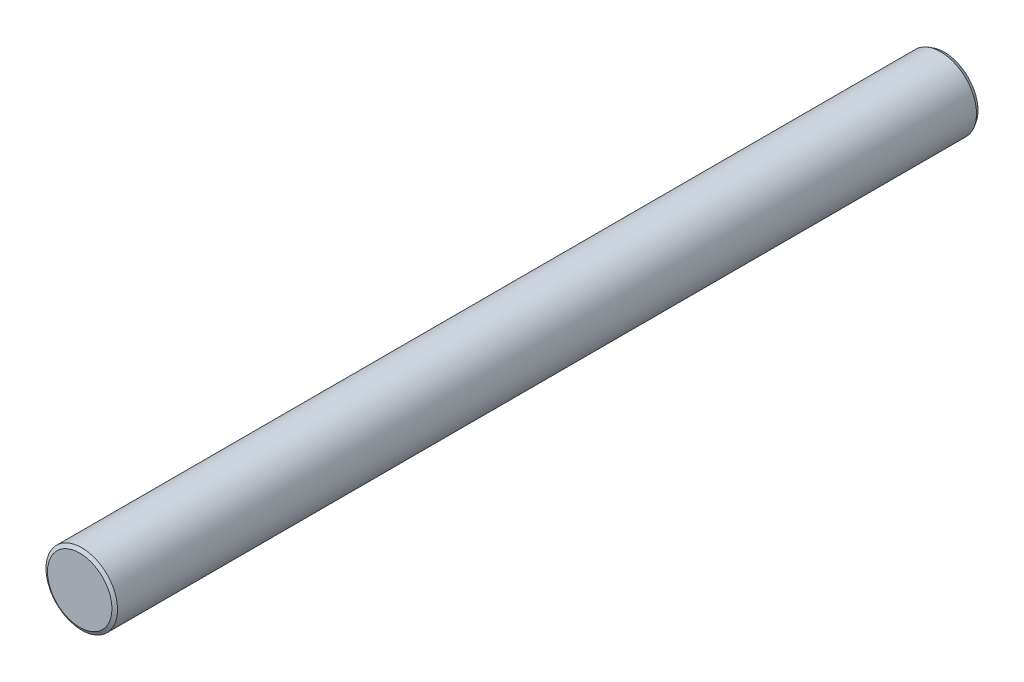
ISO-10303-21;
HEADER;
FILE_DESCRIPTION(('STEP AP214'),'2;1');
FILE_NAME('part.step','',(''),(''),'','','');
FILE_SCHEMA(('AUTOMOTIVE_DESIGN { 1 0 10303 214 1 1 1 1 }'));
ENDSEC;
DATA;
#1=APPLICATION_CONTEXT('core data for automotive mechanical design processes');
#2=APPLICATION_PROTOCOL_DEFINITION('international standard','automotive_design',2000,#1);
#3=PRODUCT_CONTEXT('',#1,'mechanical');
#4=PRODUCT('Part','Part','',(#3));
#5=PRODUCT_RELATED_PRODUCT_CATEGORY('part','',(#4));
#6=PRODUCT_DEFINITION_FORMATION('','',#4);
#7=PRODUCT_DEFINITION_CONTEXT('part definition',#1,'design');
#8=PRODUCT_DEFINITION('design','',#6,#7);
#9=PRODUCT_DEFINITION_SHAPE('','',#8);
#10=(LENGTH_UNIT() NAMED_UNIT(*) SI_UNIT(.MILLI.,.METRE.));
#11=(NAMED_UNIT(*) PLANE_ANGLE_UNIT() SI_UNIT($,.RADIAN.));
#12=(NAMED_UNIT(*) SI_UNIT($,.STERADIAN.) SOLID_ANGLE_UNIT());
#13=UNCERTAINTY_MEASURE_WITH_UNIT(LENGTH_MEASURE(1.E-05),#10,'distance_accuracy_value','');
#14=(GEOMETRIC_REPRESENTATION_CONTEXT(3) GLOBAL_UNCERTAINTY_ASSIGNED_CONTEXT((#13)) GLOBAL_UNIT_ASSIGNED_CONTEXT((#10,
#11,#12)) REPRESENTATION_CONTEXT('',''));
#15=CARTESIAN_POINT('',(0.,0.,0.));
#16=DIRECTION('',(0.,0.,1.));
#17=DIRECTION('',(1.,0.,0.));
#18=AXIS2_PLACEMENT_3D('',#15,#16,#17);
#19=CARTESIAN_POINT('',(0.,0.,42.));
#20=DIRECTION('',(0.,0.,-1.));
#21=DIRECTION('',(-1.,0.,0.));
#22=AXIS2_PLACEMENT_3D('',#19,#20,#21);
#23=CYLINDRICAL_SURFACE('',#22,3.475);
#24=CARTESIAN_POINT('',(0.,0.,-41.6535898384861));
#25=DIRECTION('',(0.,0.,1.));
#26=DIRECTION('',(1.,0.,0.));
#27=AXIS2_PLACEMENT_3D('',#24,#25,#26);
#28=CIRCLE('',#27,3.475);
#29=CARTESIAN_POINT('',(-3.475,0.,-41.6535898384861));
#30=VERTEX_POINT('',#29);
#31=EDGE_CURVE('E59',#30,#30,#28,.T.);
#32=CARTESIAN_POINT('',(0.,0.,41.8));
#33=DIRECTION('',(0.,0.,1.));
#34=DIRECTION('',(1.,0.,0.));
#35=AXIS2_PLACEMENT_3D('',#32,#33,#34);
#36=CIRCLE('',#35,3.475);
#37=CARTESIAN_POINT('',(-3.475,0.,41.8));
#38=VERTEX_POINT('',#37);
#39=EDGE_CURVE('E64',#38,#38,#36,.F.);
#40=CARTESIAN_POINT('',(-3.475,0.,-41.6535898384861));
#41=CARTESIAN_POINT('',(-3.475,0.,-40.7842816110018));
#42=CARTESIAN_POINT('',(-3.475,0.,-39.9149733835176));
#43=CARTESIAN_POINT('',(-3.475,0.,-38.1763569285491));
#44=CARTESIAN_POINT('',(-3.475,0.,-37.3070487010649));
#45=CARTESIAN_POINT('',(-3.475,0.,-35.5684322460965));
#46=CARTESIAN_POINT('',(-3.475,0.,-34.6991240186122));
#47=CARTESIAN_POINT('',(-3.475,0.,-32.9605075636438));
#48=CARTESIAN_POINT('',(-3.475,0.,-32.0911993361595));
#49=CARTESIAN_POINT('',(-3.475,0.,-30.3525828811911));
#50=CARTESIAN_POINT('',(-3.475,0.,-29.4832746537069));
#51=CARTESIAN_POINT('',(-3.475,0.,-27.7446581987384));
#52=CARTESIAN_POINT('',(-3.475,0.,-26.8753499712542));
#53=CARTESIAN_POINT('',(-3.475,0.,-25.1367335162857));
#54=CARTESIAN_POINT('',(-3.475,0.,-24.2674252888015));
#55=CARTESIAN_POINT('',(-3.475,0.,-22.528808833833));
#56=CARTESIAN_POINT('',(-3.475,0.,-21.6595006063488));
#57=CARTESIAN_POINT('',(-3.475,0.,-19.9208841513803));
#58=CARTESIAN_POINT('',(-3.475,0.,-19.0515759238961));
#59=CARTESIAN_POINT('',(-3.475,0.,-17.3129594689276));
#60=CARTESIAN_POINT('',(-3.475,0.,-16.4436512414434));
#61=CARTESIAN_POINT('',(-3.475,0.,-14.7050347864749));
#62=CARTESIAN_POINT('',(-3.475,0.,-13.8357265589907));
#63=CARTESIAN_POINT('',(-3.475,0.,-12.0971101040223));
#64=CARTESIAN_POINT('',(-3.475,0.,-11.227801876538));
#65=CARTESIAN_POINT('',(-3.475,0.,-9.48918542156956));
#66=CARTESIAN_POINT('',(-3.475,0.,-8.61987719408534));
#67=CARTESIAN_POINT('',(-3.475,0.,-6.88126073911687));
#68=CARTESIAN_POINT('',(-3.475,0.,-6.01195251163264));
#69=CARTESIAN_POINT('',(-3.475,0.,-4.27333605666418));
#70=CARTESIAN_POINT('',(-3.475,0.,-3.40402782917995));
#71=CARTESIAN_POINT('',(-3.475,0.,-1.66541137421149));
#72=CARTESIAN_POINT('',(-3.475,0.,-0.796103146727259));
#73=CARTESIAN_POINT('',(-3.475,0.,0.9425133082412));
#74=CARTESIAN_POINT('',(-3.475,0.,1.81182153572543));
#75=CARTESIAN_POINT('',(-3.475,0.,3.55043799069389));
#76=CARTESIAN_POINT('',(-3.475,0.,4.41974621817812));
#77=CARTESIAN_POINT('',(-3.475,0.,6.15836267314658));
#78=CARTESIAN_POINT('',(-3.475,0.,7.02767090063081));
#79=CARTESIAN_POINT('',(-3.475,0.,8.76628735559927));
#80=CARTESIAN_POINT('',(-3.475,0.,9.6355955830835));
#81=CARTESIAN_POINT('',(-3.475,0.,11.374212038052));
#82=CARTESIAN_POINT('',(-3.475,0.,12.2435202655362));
#83=CARTESIAN_POINT('',(-3.475,0.,13.9821367205047));
#84=CARTESIAN_POINT('',(-3.475,0.,14.8514449479889));
#85=CARTESIAN_POINT('',(-3.475,0.,16.5900614029573));
#86=CARTESIAN_POINT('',(-3.475,0.,17.4593696304416));
#87=CARTESIAN_POINT('',(-3.475,0.,19.19798608541));
#88=CARTESIAN_POINT('',(-3.475,0.,20.0672943128943));
#89=CARTESIAN_POINT('',(-3.475,0.,21.8059107678627));
#90=CARTESIAN_POINT('',(-3.475,0.,22.6752189953469));
#91=CARTESIAN_POINT('',(-3.475,0.,24.4138354503154));
#92=CARTESIAN_POINT('',(-3.475,0.,25.2831436777996));
#93=CARTESIAN_POINT('',(-3.475,0.,27.0217601327681));
#94=CARTESIAN_POINT('',(-3.475,0.,27.8910683602523));
#95=CARTESIAN_POINT('',(-3.475,0.,29.6296848152208));
#96=CARTESIAN_POINT('',(-3.475,0.,30.498993042705));
#97=CARTESIAN_POINT('',(-3.475,0.,32.2376094976735));
#98=CARTESIAN_POINT('',(-3.475,0.,33.1069177251577));
#99=CARTESIAN_POINT('',(-3.475,0.,34.8455341801262));
#100=CARTESIAN_POINT('',(-3.475,0.,35.7148424076104));
#101=CARTESIAN_POINT('',(-3.475,0.,37.4534588625789));
#102=CARTESIAN_POINT('',(-3.475,0.,38.3227670900631));
#103=CARTESIAN_POINT('',(-3.475,0.,40.0613835450316));
#104=CARTESIAN_POINT('',(-3.475,0.,40.9306917725158));
#105=CARTESIAN_POINT('',(-3.475,0.,41.8));
#106=B_SPLINE_CURVE_WITH_KNOTS('',3,(#40,#41,#42,#43,#44,#45,#46,#47,#48,#49,#50,#51,#52,#53,
#54,#55,#56,#57,#58,#59,#60,#61,#62,#63,#64,#65,#66,#67,#68,#69,#70,#71,#72,#73,#74,#75,#76,#77,
#78,#79,#80,#81,#82,#83,#84,#85,#86,#87,#88,#89,#90,#91,#92,#93,#94,#95,#96,#97,#98,#99,#100,
#101,#102,#103,#104,#105),.UNSPECIFIED.,.F.,.F.,(4,2,2,2,2,2,2,2,2,2,2,2,2,2,2,2,2,2,2,2,2,2,2,
2,2,2,2,2,2,2,2,2,4),(0.,2.60792468245269,5.21584936490538,7.82377404735807,10.4316987298108,
13.0396234122634,15.6475480947161,18.2554727771688,20.8633974596215,23.4713221420742,
26.0792468245269,28.6871715069796,31.2950961894323,33.903020871885,36.5109455543377,
39.1188702367904,41.726794919243,44.3347196016957,46.9426442841484,49.5505689666011,
52.1584936490538,54.7664183315065,57.3743430139592,59.9822676964119,62.5901923788646,
65.1981170613172,67.8060417437699,70.4139664262226,73.0218911086753,75.629815791128,
78.2377404735807,80.8456651560334,83.4535898384861),.UNSPECIFIED.);
#107=EDGE_CURVE('BSEAM45',#30,#38,#106,.T.);
#108=ORIENTED_EDGE('',*,*,#31,.T.);
#109=ORIENTED_EDGE('',*,*,#39,.T.);
#110=ORIENTED_EDGE('',*,*,#107,.T.);
#111=ORIENTED_EDGE('',*,*,#107,.F.);
#112=EDGE_LOOP('',(#108,#110,#109,#111));
#113=FACE_BOUND('',#112,.T.);
#114=ADVANCED_FACE('F45',(#113),#23,.T.);
#115=CARTESIAN_POINT('',(0.,0.,42.));
#116=DIRECTION('',(0.,0.,1.));
#117=DIRECTION('',(1.,0.,0.));
#118=AXIS2_PLACEMENT_3D('',#115,#116,#117);
#119=PLANE('',#118);
#120=CARTESIAN_POINT('',(0.,0.,42.));
#121=DIRECTION('',(0.,0.,1.));
#122=DIRECTION('',(1.,0.,0.));
#123=AXIS2_PLACEMENT_3D('',#120,#121,#122);
#124=CIRCLE('',#123,3.12858983848624);
#125=CARTESIAN_POINT('',(3.12858983848624,0.,42.));
#126=VERTEX_POINT('',#125);
#127=EDGE_CURVE('E10',#126,#126,#124,.T.);
#128=ORIENTED_EDGE('',*,*,#127,.T.);
#129=EDGE_LOOP('',(#128));
#130=FACE_BOUND('',#129,.T.);
#131=ADVANCED_FACE('F81',(#130),#119,.T.);
#132=CARTESIAN_POINT('',(0.,0.,-42.));
#133=DIRECTION('',(0.,0.,1.));
#134=DIRECTION('',(1.,0.,0.));
#135=AXIS2_PLACEMENT_3D('',#132,#133,#134);
#136=PLANE('',#135);
#137=CARTESIAN_POINT('',(0.,0.,-42.));
#138=DIRECTION('',(0.,0.,1.));
#139=DIRECTION('',(1.,0.,0.));
#140=AXIS2_PLACEMENT_3D('',#137,#138,#139);
#141=CIRCLE('',#140,3.27499999999992);
#142=CARTESIAN_POINT('',(3.27499999999992,0.,-42.));
#143=VERTEX_POINT('',#142);
#144=EDGE_CURVE('E54',#143,#143,#141,.F.);
#145=ORIENTED_EDGE('',*,*,#144,.T.);
#146=EDGE_LOOP('',(#145));
#147=FACE_BOUND('',#146,.T.);
#148=ADVANCED_FACE('F78',(#147),#136,.F.);
#149=CARTESIAN_POINT('',(0.,0.,-41.6535898384861));
#150=DIRECTION('',(0.,0.,1.));
#151=DIRECTION('',(1.,0.,0.));
#152=AXIS2_PLACEMENT_3D('',#149,#150,#151);
#153=CONICAL_SURFACE('',#152,3.475,0.523598775598287);
#154=ORIENTED_EDGE('',*,*,#144,.F.);
#155=EDGE_LOOP('',(#154));
#156=FACE_BOUND('',#155,.T.);
#157=ORIENTED_EDGE('',*,*,#31,.F.);
#158=EDGE_LOOP('',(#157));
#159=FACE_BOUND('',#158,.T.);
#160=ADVANCED_FACE('F74',(#156,#159),#153,.T.);
#161=CARTESIAN_POINT('',(0.,0.,42.));
#162=DIRECTION('',(0.,0.,-1.));
#163=DIRECTION('',(-1.,0.,0.));
#164=AXIS2_PLACEMENT_3D('',#161,#162,#163);
#165=CONICAL_SURFACE('',#164,3.12858983848624,1.0471975511966);
#166=ORIENTED_EDGE('',*,*,#39,.F.);
#167=EDGE_LOOP('',(#166));
#168=FACE_BOUND('',#167,.T.);
#169=ORIENTED_EDGE('',*,*,#127,.F.);
#170=EDGE_LOOP('',(#169));
#171=FACE_BOUND('',#170,.T.);
#172=ADVANCED_FACE('F48',(#168,#171),#165,.T.);
#173=CLOSED_SHELL('',(#114,#131,#148,#160,#172));
#174=MANIFOLD_SOLID_BREP('B2',#173);
#175=ADVANCED_BREP_SHAPE_REPRESENTATION('',(#18,#174),#14);
#176=SHAPE_DEFINITION_REPRESENTATION(#9,#175);
ENDSEC;
END-ISO-10303-21;
